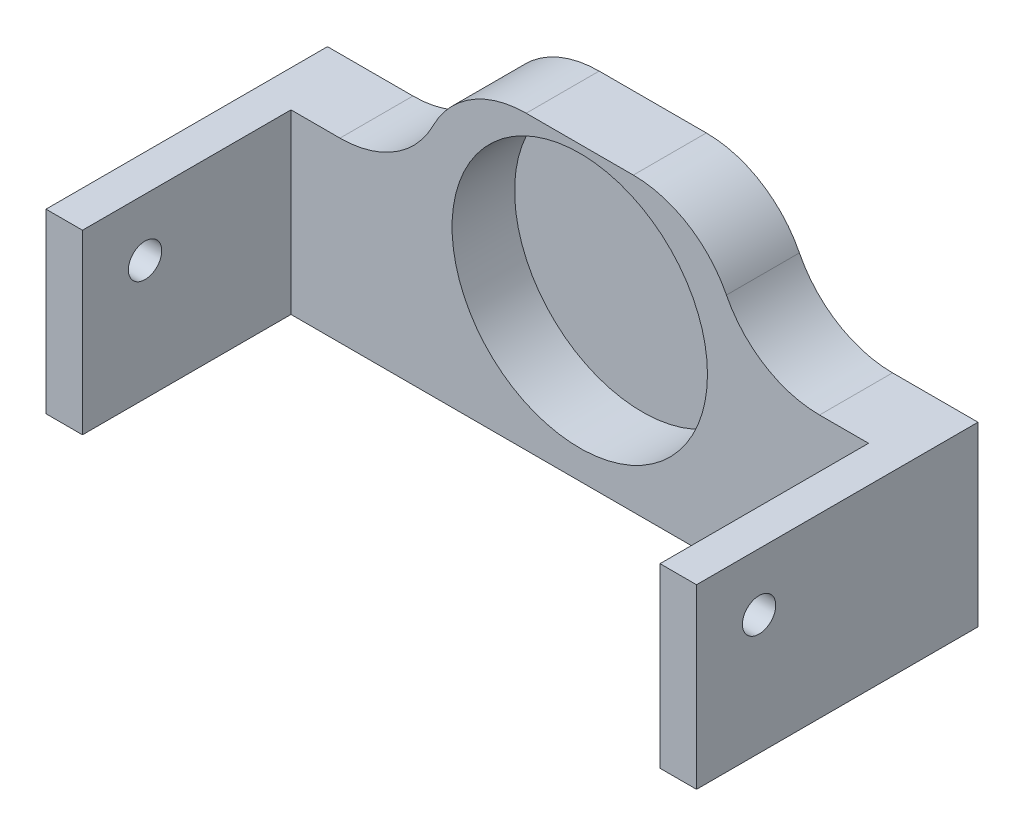
ISO-10303-21;
HEADER;
FILE_DESCRIPTION(('STEP AP214'),'2;1');
FILE_NAME('part.step','',(''),(''),'','','');
FILE_SCHEMA(('AUTOMOTIVE_DESIGN { 1 0 10303 214 1 1 1 1 }'));
ENDSEC;
DATA;
#1=APPLICATION_CONTEXT('core data for automotive mechanical design processes');
#2=APPLICATION_PROTOCOL_DEFINITION('international standard','automotive_design',2000,#1);
#3=PRODUCT_CONTEXT('',#1,'mechanical');
#4=PRODUCT('Part','Part','',(#3));
#5=PRODUCT_RELATED_PRODUCT_CATEGORY('part','',(#4));
#6=PRODUCT_DEFINITION_FORMATION('','',#4);
#7=PRODUCT_DEFINITION_CONTEXT('part definition',#1,'design');
#8=PRODUCT_DEFINITION('design','',#6,#7);
#9=PRODUCT_DEFINITION_SHAPE('','',#8);
#10=(LENGTH_UNIT() NAMED_UNIT(*) SI_UNIT(.MILLI.,.METRE.));
#11=(NAMED_UNIT(*) PLANE_ANGLE_UNIT() SI_UNIT($,.RADIAN.));
#12=(NAMED_UNIT(*) SI_UNIT($,.STERADIAN.) SOLID_ANGLE_UNIT());
#13=UNCERTAINTY_MEASURE_WITH_UNIT(LENGTH_MEASURE(1.E-05),#10,'distance_accuracy_value','');
#14=(GEOMETRIC_REPRESENTATION_CONTEXT(3) GLOBAL_UNCERTAINTY_ASSIGNED_CONTEXT((#13)) GLOBAL_UNIT_ASSIGNED_CONTEXT((#10,
#11,#12)) REPRESENTATION_CONTEXT('',''));
#15=CARTESIAN_POINT('',(0.,0.,0.));
#16=DIRECTION('',(0.,0.,1.));
#17=DIRECTION('',(1.,0.,0.));
#18=AXIS2_PLACEMENT_3D('',#15,#16,#17);
#19=CARTESIAN_POINT('',(0.,0.,7.));
#20=DIRECTION('',(0.,0.,1.));
#21=DIRECTION('',(1.,0.,0.));
#22=AXIS2_PLACEMENT_3D('',#19,#20,#21);
#23=PLANE('',#22);
#24=CARTESIAN_POINT('',(14.9668356823349,-6.75269130805009,7.));
#25=DIRECTION('',(0.,0.,1.));
#26=DIRECTION('',(1.,0.,0.));
#27=AXIS2_PLACEMENT_3D('',#24,#25,#26);
#28=CIRCLE('',#27,12.25);
#29=CARTESIAN_POINT('',(27.2168356823349,-6.75269130805009,7.));
#30=VERTEX_POINT('',#29);
#31=EDGE_CURVE('E182',#30,#30,#28,.T.);
#32=ORIENTED_EDGE('',*,*,#31,.F.);
#33=EDGE_LOOP('',(#32));
#34=FACE_BOUND('',#33,.T.);
#35=DIRECTION('',(1.,0.,0.));
#36=VECTOR('',#35,1.);
#37=CARTESIAN_POINT('',(-16.2331643176651,-21.7526913080501,7.));
#38=LINE('',#37,#36);
#39=CARTESIAN_POINT('',(-12.7331643176651,-21.7526913080501,7.));
#40=VERTEX_POINT('',#39);
#41=CARTESIAN_POINT('',(42.6668356823349,-21.7526913080501,7.));
#42=VERTEX_POINT('',#41);
#43=EDGE_CURVE('E163',#40,#42,#38,.T.);
#44=ORIENTED_EDGE('',*,*,#43,.T.);
#45=DIRECTION('',(0.,-1.,0.));
#46=VECTOR('',#45,1.);
#47=CARTESIAN_POINT('',(42.6668356823349,-4.75269130805009,7.));
#48=LINE('',#47,#46);
#49=CARTESIAN_POINT('',(42.6668356823349,-4.75269130805009,7.));
#50=VERTEX_POINT('',#49);
#51=EDGE_CURVE('E147',#50,#42,#48,.T.);
#52=ORIENTED_EDGE('',*,*,#51,.F.);
#53=DIRECTION('',(1.,0.,0.));
#54=VECTOR('',#53,1.);
#55=CARTESIAN_POINT('',(46.1668356823349,-4.75269130805009,7.));
#56=LINE('',#55,#54);
#57=CARTESIAN_POINT('',(37.9668356823349,-4.75269130805009,7.));
#58=VERTEX_POINT('',#57);
#59=EDGE_CURVE('E287',#58,#50,#56,.T.);
#60=ORIENTED_EDGE('',*,*,#59,.F.);
#61=CARTESIAN_POINT('',(37.9668356823349,5.24730869194991,7.));
#62=DIRECTION('',(0.,0.,1.));
#63=DIRECTION('',(1.,0.,0.));
#64=AXIS2_PLACEMENT_3D('',#61,#62,#63);
#65=CIRCLE('',#64,10.);
#66=CARTESIAN_POINT('',(29.036550132589,0.747308691949914,7.));
#67=VERTEX_POINT('',#66);
#68=EDGE_CURVE('E209',#58,#67,#65,.F.);
#69=ORIENTED_EDGE('',*,*,#68,.T.);
#70=CARTESIAN_POINT('',(20.1062645828431,-3.75269130805009,7.));
#71=DIRECTION('',(0.,0.,1.));
#72=DIRECTION('',(1.,0.,0.));
#73=AXIS2_PLACEMENT_3D('',#70,#71,#72);
#74=CIRCLE('',#73,10.);
#75=CARTESIAN_POINT('',(20.1062645828431,6.24730869194991,7.));
#76=VERTEX_POINT('',#75);
#77=EDGE_CURVE('E230',#67,#76,#74,.T.);
#78=ORIENTED_EDGE('',*,*,#77,.T.);
#79=DIRECTION('',(-1.,0.,0.));
#80=VECTOR('',#79,1.);
#81=CARTESIAN_POINT('',(-16.2331643176651,6.24730869194991,7.));
#82=LINE('',#81,#80);
#83=CARTESIAN_POINT('',(9.82740678182662,6.24730869194991,7.));
#84=VERTEX_POINT('',#83);
#85=EDGE_CURVE('E170',#76,#84,#82,.T.);
#86=ORIENTED_EDGE('',*,*,#85,.T.);
#87=CARTESIAN_POINT('',(9.82740678182662,-3.75269130805009,7.));
#88=DIRECTION('',(0.,0.,1.));
#89=DIRECTION('',(1.,0.,0.));
#90=AXIS2_PLACEMENT_3D('',#87,#88,#89);
#91=CIRCLE('',#90,10.);
#92=CARTESIAN_POINT('',(0.897121232080748,0.747308691949914,7.));
#93=VERTEX_POINT('',#92);
#94=EDGE_CURVE('E227',#84,#93,#91,.T.);
#95=ORIENTED_EDGE('',*,*,#94,.T.);
#96=CARTESIAN_POINT('',(-8.03316431766513,5.24730869194991,7.));
#97=DIRECTION('',(0.,0.,1.));
#98=DIRECTION('',(1.,0.,0.));
#99=AXIS2_PLACEMENT_3D('',#96,#97,#98);
#100=CIRCLE('',#99,10.);
#101=CARTESIAN_POINT('',(-8.03316431766513,-4.75269130805009,7.));
#102=VERTEX_POINT('',#101);
#103=EDGE_CURVE('E216',#93,#102,#100,.F.);
#104=ORIENTED_EDGE('',*,*,#103,.T.);
#105=DIRECTION('',(1.,0.,0.));
#106=VECTOR('',#105,1.);
#107=CARTESIAN_POINT('',(-16.2331643176651,-4.75269130805009,7.));
#108=LINE('',#107,#106);
#109=CARTESIAN_POINT('',(-12.7331643176651,-4.75269130805009,7.));
#110=VERTEX_POINT('',#109);
#111=EDGE_CURVE('E272',#110,#102,#108,.T.);
#112=ORIENTED_EDGE('',*,*,#111,.F.);
#113=DIRECTION('',(0.,1.,0.));
#114=VECTOR('',#113,1.);
#115=CARTESIAN_POINT('',(-12.7331643176651,-4.75269130805009,7.));
#116=LINE('',#115,#114);
#117=EDGE_CURVE('E60',#40,#110,#116,.T.);
#118=ORIENTED_EDGE('',*,*,#117,.F.);
#119=EDGE_LOOP('',(#44,#52,#60,#69,#78,#86,#95,#104,#112,#118));
#120=FACE_BOUND('',#119,.T.);
#121=ADVANCED_FACE('F43',(#34,#120),#23,.T.);
#122=CARTESIAN_POINT('',(-16.2331643176651,6.24730869194991,7.));
#123=DIRECTION('',(1.,0.,0.));
#124=DIRECTION('',(0.,1.,0.));
#125=AXIS2_PLACEMENT_3D('',#122,#123,#124);
#126=PLANE('',#125);
#127=CARTESIAN_POINT('',(-16.2331643176651,-10.2526913080501,21.));
#128=DIRECTION('',(-1.,0.,0.));
#129=DIRECTION('',(0.,-1.,0.));
#130=AXIS2_PLACEMENT_3D('',#127,#128,#129);
#131=CIRCLE('',#130,1.6);
#132=CARTESIAN_POINT('',(-16.2331643176651,-11.8526913080501,21.));
#133=VERTEX_POINT('',#132);
#134=EDGE_CURVE('E515',#133,#133,#131,.T.);
#135=ORIENTED_EDGE('',*,*,#134,.F.);
#136=EDGE_LOOP('',(#135));
#137=FACE_BOUND('',#136,.T.);
#138=DIRECTION('',(0.,0.,-1.));
#139=VECTOR('',#138,1.);
#140=CARTESIAN_POINT('',(-16.2331643176651,-21.7526913080501,7.));
#141=LINE('',#140,#139);
#142=CARTESIAN_POINT('',(-16.2331643176651,-21.7526913080501,27.));
#143=VERTEX_POINT('',#142);
#144=CARTESIAN_POINT('',(-16.2331643176651,-21.7526913080501,0.));
#145=VERTEX_POINT('',#144);
#146=EDGE_CURVE('E198',#143,#145,#141,.T.);
#147=ORIENTED_EDGE('',*,*,#146,.F.);
#148=DIRECTION('',(0.,-1.,0.));
#149=VECTOR('',#148,1.);
#150=CARTESIAN_POINT('',(-16.2331643176651,-4.75269130805009,27.));
#151=LINE('',#150,#149);
#152=CARTESIAN_POINT('',(-16.2331643176651,-4.75269130805009,27.));
#153=VERTEX_POINT('',#152);
#154=EDGE_CURVE('E539',#153,#143,#151,.T.);
#155=ORIENTED_EDGE('',*,*,#154,.F.);
#156=DIRECTION('',(0.,0.,1.));
#157=VECTOR('',#156,1.);
#158=CARTESIAN_POINT('',(-16.2331643176651,-4.75269130805009,-0.00100000000000013));
#159=LINE('',#158,#157);
#160=CARTESIAN_POINT('',(-16.2331643176651,-4.75269130805009,0.));
#161=VERTEX_POINT('',#160);
#162=EDGE_CURVE('E276',#161,#153,#159,.T.);
#163=ORIENTED_EDGE('',*,*,#162,.F.);
#164=DIRECTION('',(0.,-1.,0.));
#165=VECTOR('',#164,1.);
#166=CARTESIAN_POINT('',(-16.2331643176651,6.24730869194991,0.));
#167=LINE('',#166,#165);
#168=EDGE_CURVE('E185',#161,#145,#167,.T.);
#169=ORIENTED_EDGE('',*,*,#168,.T.);
#170=EDGE_LOOP('',(#147,#155,#163,#169));
#171=FACE_BOUND('',#170,.T.);
#172=ADVANCED_FACE('F306',(#137,#171),#126,.F.);
#173=CARTESIAN_POINT('',(-16.2331643176651,-21.7526913080501,7.));
#174=DIRECTION('',(0.,1.,0.));
#175=DIRECTION('',(0.,0.,1.));
#176=AXIS2_PLACEMENT_3D('',#173,#174,#175);
#177=PLANE('',#176);
#178=DIRECTION('',(1.,0.,0.));
#179=VECTOR('',#178,1.);
#180=CARTESIAN_POINT('',(-16.2331643176651,-21.7526913080501,0.));
#181=LINE('',#180,#179);
#182=CARTESIAN_POINT('',(46.1668356823349,-21.7526913080501,0.));
#183=VERTEX_POINT('',#182);
#184=EDGE_CURVE('E188',#145,#183,#181,.T.);
#185=ORIENTED_EDGE('',*,*,#184,.T.);
#186=DIRECTION('',(0.,0.,-1.));
#187=VECTOR('',#186,1.);
#188=CARTESIAN_POINT('',(46.1668356823349,-21.7526913080501,7.));
#189=LINE('',#188,#187);
#190=CARTESIAN_POINT('',(46.1668356823349,-21.7526913080501,27.));
#191=VERTEX_POINT('',#190);
#192=EDGE_CURVE('E176',#191,#183,#189,.T.);
#193=ORIENTED_EDGE('',*,*,#192,.F.);
#194=DIRECTION('',(1.,0.,0.));
#195=VECTOR('',#194,1.);
#196=CARTESIAN_POINT('',(46.1668356823349,-21.7526913080501,27.));
#197=LINE('',#196,#195);
#198=CARTESIAN_POINT('',(42.6668356823349,-21.7526913080501,27.));
#199=VERTEX_POINT('',#198);
#200=EDGE_CURVE('E166',#199,#191,#197,.T.);
#201=ORIENTED_EDGE('',*,*,#200,.F.);
#202=DIRECTION('',(0.,0.,-1.));
#203=VECTOR('',#202,1.);
#204=CARTESIAN_POINT('',(42.6668356823349,-21.7526913080501,27.));
#205=LINE('',#204,#203);
#206=EDGE_CURVE('E151',#199,#42,#205,.T.);
#207=ORIENTED_EDGE('',*,*,#206,.T.);
#208=ORIENTED_EDGE('',*,*,#43,.F.);
#209=DIRECTION('',(0.,0.,-1.));
#210=VECTOR('',#209,1.);
#211=CARTESIAN_POINT('',(-12.7331643176651,-21.7526913080501,27.));
#212=LINE('',#211,#210);
#213=CARTESIAN_POINT('',(-12.7331643176651,-21.7526913080501,27.));
#214=VERTEX_POINT('',#213);
#215=EDGE_CURVE('E288',#214,#40,#212,.T.);
#216=ORIENTED_EDGE('',*,*,#215,.F.);
#217=DIRECTION('',(1.,0.,0.));
#218=VECTOR('',#217,1.);
#219=CARTESIAN_POINT('',(-16.2331643176651,-21.7526913080501,27.));
#220=LINE('',#219,#218);
#221=EDGE_CURVE('E543',#143,#214,#220,.T.);
#222=ORIENTED_EDGE('',*,*,#221,.F.);
#223=ORIENTED_EDGE('',*,*,#146,.T.);
#224=EDGE_LOOP('',(#185,#193,#201,#207,#208,#216,#222,#223));
#225=FACE_BOUND('',#224,.T.);
#226=ADVANCED_FACE('F161',(#225),#177,.F.);
#227=CARTESIAN_POINT('',(46.1668356823349,6.24730869194991,7.));
#228=DIRECTION('',(-1.,0.,0.));
#229=DIRECTION('',(0.,0.,1.));
#230=AXIS2_PLACEMENT_3D('',#227,#228,#229);
#231=PLANE('',#230);
#232=CARTESIAN_POINT('',(46.1668356823349,-10.2526913080501,21.));
#233=DIRECTION('',(-1.,0.,0.));
#234=DIRECTION('',(0.,-1.,0.));
#235=AXIS2_PLACEMENT_3D('',#232,#233,#234);
#236=CIRCLE('',#235,1.6);
#237=CARTESIAN_POINT('',(46.1668356823349,-11.8526913080501,21.));
#238=VERTEX_POINT('',#237);
#239=EDGE_CURVE('E524',#238,#238,#236,.T.);
#240=ORIENTED_EDGE('',*,*,#239,.T.);
#241=EDGE_LOOP('',(#240));
#242=FACE_BOUND('',#241,.T.);
#243=DIRECTION('',(0.,1.,0.));
#244=VECTOR('',#243,1.);
#245=CARTESIAN_POINT('',(46.1668356823349,6.24730869194991,0.));
#246=LINE('',#245,#244);
#247=CARTESIAN_POINT('',(46.1668356823349,-4.75269130805009,0.));
#248=VERTEX_POINT('',#247);
#249=EDGE_CURVE('E179',#183,#248,#246,.T.);
#250=ORIENTED_EDGE('',*,*,#249,.T.);
#251=DIRECTION('',(0.,0.,1.));
#252=VECTOR('',#251,1.);
#253=CARTESIAN_POINT('',(46.1668356823349,-4.75269130805009,-0.00100000000000013));
#254=LINE('',#253,#252);
#255=CARTESIAN_POINT('',(46.1668356823349,-4.75269130805009,27.));
#256=VERTEX_POINT('',#255);
#257=EDGE_CURVE('E284',#248,#256,#254,.T.);
#258=ORIENTED_EDGE('',*,*,#257,.T.);
#259=DIRECTION('',(0.,1.,0.));
#260=VECTOR('',#259,1.);
#261=CARTESIAN_POINT('',(46.1668356823349,-4.75269130805009,27.));
#262=LINE('',#261,#260);
#263=EDGE_CURVE('E158',#191,#256,#262,.T.);
#264=ORIENTED_EDGE('',*,*,#263,.F.);
#265=ORIENTED_EDGE('',*,*,#192,.T.);
#266=EDGE_LOOP('',(#250,#258,#264,#265));
#267=FACE_BOUND('',#266,.T.);
#268=ADVANCED_FACE('F319',(#242,#267),#231,.F.);
#269=CARTESIAN_POINT('',(-16.2331643176651,6.24730869194991,7.));
#270=DIRECTION('',(0.,-1.,0.));
#271=DIRECTION('',(0.,0.,-1.));
#272=AXIS2_PLACEMENT_3D('',#269,#270,#271);
#273=PLANE('',#272);
#274=ORIENTED_EDGE('',*,*,#85,.F.);
#275=DIRECTION('',(0.,0.,-1.));
#276=VECTOR('',#275,1.);
#277=CARTESIAN_POINT('',(20.1062645828431,6.24730869194991,7.));
#278=LINE('',#277,#276);
#279=CARTESIAN_POINT('',(20.1062645828431,6.24730869194991,0.));
#280=VERTEX_POINT('',#279);
#281=EDGE_CURVE('E237',#76,#280,#278,.T.);
#282=ORIENTED_EDGE('',*,*,#281,.T.);
#283=DIRECTION('',(-1.,0.,0.));
#284=VECTOR('',#283,1.);
#285=CARTESIAN_POINT('',(-16.2331643176651,6.24730869194991,0.));
#286=LINE('',#285,#284);
#287=CARTESIAN_POINT('',(9.82740678182662,6.24730869194991,0.));
#288=VERTEX_POINT('',#287);
#289=EDGE_CURVE('E171',#280,#288,#286,.T.);
#290=ORIENTED_EDGE('',*,*,#289,.T.);
#291=DIRECTION('',(0.,0.,-1.));
#292=VECTOR('',#291,1.);
#293=CARTESIAN_POINT('',(9.82740678182662,6.24730869194991,7.));
#294=LINE('',#293,#292);
#295=EDGE_CURVE('E233',#288,#84,#294,.F.);
#296=ORIENTED_EDGE('',*,*,#295,.T.);
#297=EDGE_LOOP('',(#274,#282,#290,#296));
#298=FACE_BOUND('',#297,.T.);
#299=ADVANCED_FACE('F260',(#298),#273,.F.);
#300=CARTESIAN_POINT('',(0.,0.,0.));
#301=DIRECTION('',(0.,0.,1.));
#302=DIRECTION('',(1.,0.,0.));
#303=AXIS2_PLACEMENT_3D('',#300,#301,#302);
#304=PLANE('',#303);
#305=ORIENTED_EDGE('',*,*,#289,.F.);
#306=CARTESIAN_POINT('',(20.1062645828431,-3.75269130805009,0.));
#307=DIRECTION('',(0.,0.,1.));
#308=DIRECTION('',(1.,0.,0.));
#309=AXIS2_PLACEMENT_3D('',#306,#307,#308);
#310=CIRCLE('',#309,10.);
#311=CARTESIAN_POINT('',(29.036550132589,0.747308691949914,0.));
#312=VERTEX_POINT('',#311);
#313=EDGE_CURVE('E53',#280,#312,#310,.F.);
#314=ORIENTED_EDGE('',*,*,#313,.T.);
#315=CARTESIAN_POINT('',(37.9668356823349,5.24730869194991,0.));
#316=DIRECTION('',(0.,0.,1.));
#317=DIRECTION('',(1.,0.,0.));
#318=AXIS2_PLACEMENT_3D('',#315,#316,#317);
#319=CIRCLE('',#318,10.);
#320=CARTESIAN_POINT('',(37.9668356823349,-4.75269130805009,0.));
#321=VERTEX_POINT('',#320);
#322=EDGE_CURVE('E213',#312,#321,#319,.T.);
#323=ORIENTED_EDGE('',*,*,#322,.T.);
#324=DIRECTION('',(-1.,0.,0.));
#325=VECTOR('',#324,1.);
#326=CARTESIAN_POINT('',(46.1668356823349,-4.75269130805009,0.));
#327=LINE('',#326,#325);
#328=EDGE_CURVE('E291',#248,#321,#327,.T.);
#329=ORIENTED_EDGE('',*,*,#328,.F.);
#330=ORIENTED_EDGE('',*,*,#249,.F.);
#331=ORIENTED_EDGE('',*,*,#184,.F.);
#332=ORIENTED_EDGE('',*,*,#168,.F.);
#333=DIRECTION('',(-1.,0.,0.));
#334=VECTOR('',#333,1.);
#335=CARTESIAN_POINT('',(-16.2331643176651,-4.75269130805009,0.));
#336=LINE('',#335,#334);
#337=CARTESIAN_POINT('',(-8.03316431766513,-4.75269130805009,0.));
#338=VERTEX_POINT('',#337);
#339=EDGE_CURVE('E269',#338,#161,#336,.T.);
#340=ORIENTED_EDGE('',*,*,#339,.F.);
#341=CARTESIAN_POINT('',(-8.03316431766513,5.24730869194991,0.));
#342=DIRECTION('',(0.,0.,1.));
#343=DIRECTION('',(1.,0.,0.));
#344=AXIS2_PLACEMENT_3D('',#341,#342,#343);
#345=CIRCLE('',#344,10.);
#346=CARTESIAN_POINT('',(0.897121232080748,0.747308691949914,0.));
#347=VERTEX_POINT('',#346);
#348=EDGE_CURVE('E220',#338,#347,#345,.T.);
#349=ORIENTED_EDGE('',*,*,#348,.T.);
#350=CARTESIAN_POINT('',(9.82740678182662,-3.75269130805009,0.));
#351=DIRECTION('',(0.,0.,1.));
#352=DIRECTION('',(1.,0.,0.));
#353=AXIS2_PLACEMENT_3D('',#350,#351,#352);
#354=CIRCLE('',#353,10.);
#355=EDGE_CURVE('E240',#347,#288,#354,.F.);
#356=ORIENTED_EDGE('',*,*,#355,.T.);
#357=EDGE_LOOP('',(#305,#314,#323,#329,#330,#331,#332,#340,#349,#356));
#358=FACE_BOUND('',#357,.T.);
#359=ADVANCED_FACE('F248',(#358),#304,.F.);
#360=CARTESIAN_POINT('',(14.9668356823349,-6.75269130805009,1.));
#361=DIRECTION('',(0.,0.,1.));
#362=DIRECTION('',(1.,0.,0.));
#363=AXIS2_PLACEMENT_3D('',#360,#361,#362);
#364=CYLINDRICAL_SURFACE('',#363,12.25);
#365=CARTESIAN_POINT('',(14.9668356823349,-6.75269130805009,1.));
#366=DIRECTION('',(0.,0.,1.));
#367=DIRECTION('',(1.,0.,0.));
#368=AXIS2_PLACEMENT_3D('',#365,#366,#367);
#369=CIRCLE('',#368,12.25);
#370=CARTESIAN_POINT('',(27.2168356823349,-6.75269130805009,1.));
#371=VERTEX_POINT('',#370);
#372=EDGE_CURVE('E189',#371,#371,#369,.T.);
#373=ORIENTED_EDGE('',*,*,#372,.F.);
#374=EDGE_LOOP('',(#373));
#375=FACE_BOUND('',#374,.T.);
#376=ORIENTED_EDGE('',*,*,#31,.T.);
#377=EDGE_LOOP('',(#376));
#378=FACE_BOUND('',#377,.T.);
#379=ADVANCED_FACE('F299',(#375,#378),#364,.F.);
#380=CARTESIAN_POINT('',(14.9668356823349,-6.75269130805009,1.));
#381=DIRECTION('',(0.,0.,1.));
#382=DIRECTION('',(1.,0.,0.));
#383=AXIS2_PLACEMENT_3D('',#380,#381,#382);
#384=PLANE('',#383);
#385=ORIENTED_EDGE('',*,*,#372,.T.);
#386=EDGE_LOOP('',(#385));
#387=FACE_BOUND('',#386,.T.);
#388=ADVANCED_FACE('F297',(#387),#384,.T.);
#389=CARTESIAN_POINT('',(46.1668356823349,-4.75269130805009,-0.00100000000000013));
#390=DIRECTION('',(0.,-1.,0.));
#391=DIRECTION('',(0.,0.,-1.));
#392=AXIS2_PLACEMENT_3D('',#389,#390,#391);
#393=PLANE('',#392);
#394=ORIENTED_EDGE('',*,*,#328,.T.);
#395=DIRECTION('',(0.,0.,1.));
#396=VECTOR('',#395,1.);
#397=CARTESIAN_POINT('',(37.9668356823349,-4.75269130805009,7.));
#398=LINE('',#397,#396);
#399=EDGE_CURVE('E202',#321,#58,#398,.T.);
#400=ORIENTED_EDGE('',*,*,#399,.T.);
#401=ORIENTED_EDGE('',*,*,#59,.T.);
#402=DIRECTION('',(0.,0.,-1.));
#403=VECTOR('',#402,1.);
#404=CARTESIAN_POINT('',(42.6668356823349,-4.75269130805009,27.));
#405=LINE('',#404,#403);
#406=CARTESIAN_POINT('',(42.6668356823349,-4.75269130805009,27.));
#407=VERTEX_POINT('',#406);
#408=EDGE_CURVE('E154',#407,#50,#405,.T.);
#409=ORIENTED_EDGE('',*,*,#408,.F.);
#410=DIRECTION('',(-1.,0.,0.));
#411=VECTOR('',#410,1.);
#412=CARTESIAN_POINT('',(46.1668356823349,-4.75269130805009,27.));
#413=LINE('',#412,#411);
#414=EDGE_CURVE('E533',#256,#407,#413,.T.);
#415=ORIENTED_EDGE('',*,*,#414,.F.);
#416=ORIENTED_EDGE('',*,*,#257,.F.);
#417=EDGE_LOOP('',(#394,#400,#401,#409,#415,#416));
#418=FACE_BOUND('',#417,.T.);
#419=ADVANCED_FACE('F350',(#418),#393,.F.);
#420=CARTESIAN_POINT('',(-16.2331643176651,-4.75269130805009,-0.00100000000000013));
#421=DIRECTION('',(0.,-1.,0.));
#422=DIRECTION('',(0.,0.,-1.));
#423=AXIS2_PLACEMENT_3D('',#420,#421,#422);
#424=PLANE('',#423);
#425=ORIENTED_EDGE('',*,*,#162,.T.);
#426=DIRECTION('',(-1.,0.,0.));
#427=VECTOR('',#426,1.);
#428=CARTESIAN_POINT('',(-16.2331643176651,-4.75269130805009,27.));
#429=LINE('',#428,#427);
#430=CARTESIAN_POINT('',(-12.7331643176651,-4.75269130805009,27.));
#431=VERTEX_POINT('',#430);
#432=EDGE_CURVE('E549',#431,#153,#429,.T.);
#433=ORIENTED_EDGE('',*,*,#432,.F.);
#434=DIRECTION('',(0.,0.,-1.));
#435=VECTOR('',#434,1.);
#436=CARTESIAN_POINT('',(-12.7331643176651,-4.75269130805009,27.));
#437=LINE('',#436,#435);
#438=EDGE_CURVE('E553',#431,#110,#437,.T.);
#439=ORIENTED_EDGE('',*,*,#438,.T.);
#440=ORIENTED_EDGE('',*,*,#111,.T.);
#441=DIRECTION('',(0.,0.,1.));
#442=VECTOR('',#441,1.);
#443=CARTESIAN_POINT('',(-8.03316431766513,-4.75269130805009,0.));
#444=LINE('',#443,#442);
#445=EDGE_CURVE('E206',#102,#338,#444,.F.);
#446=ORIENTED_EDGE('',*,*,#445,.T.);
#447=ORIENTED_EDGE('',*,*,#339,.T.);
#448=EDGE_LOOP('',(#425,#433,#439,#440,#446,#447));
#449=FACE_BOUND('',#448,.T.);
#450=ADVANCED_FACE('F268',(#449),#424,.F.);
#451=CARTESIAN_POINT('',(37.9668356823349,5.24730869194991,-0.00100000000000013));
#452=DIRECTION('',(0.,0.,-1.));
#453=DIRECTION('',(-1.,0.,0.));
#454=AXIS2_PLACEMENT_3D('',#451,#452,#453);
#455=CYLINDRICAL_SURFACE('',#454,10.);
#456=ORIENTED_EDGE('',*,*,#322,.F.);
#457=DIRECTION('',(0.,0.,-1.));
#458=VECTOR('',#457,1.);
#459=CARTESIAN_POINT('',(29.036550132589,0.747308691949915,-0.00100000000000013));
#460=LINE('',#459,#458);
#461=EDGE_CURVE('E223',#312,#67,#460,.F.);
#462=ORIENTED_EDGE('',*,*,#461,.T.);
#463=ORIENTED_EDGE('',*,*,#68,.F.);
#464=ORIENTED_EDGE('',*,*,#399,.F.);
#465=EDGE_LOOP('',(#456,#462,#463,#464));
#466=FACE_BOUND('',#465,.T.);
#467=ADVANCED_FACE('F256',(#466),#455,.F.);
#468=CARTESIAN_POINT('',(-8.03316431766513,5.24730869194991,-0.00100000000000013));
#469=DIRECTION('',(0.,0.,-1.));
#470=DIRECTION('',(-1.,0.,0.));
#471=AXIS2_PLACEMENT_3D('',#468,#469,#470);
#472=CYLINDRICAL_SURFACE('',#471,10.);
#473=ORIENTED_EDGE('',*,*,#103,.F.);
#474=DIRECTION('',(0.,0.,-1.));
#475=VECTOR('',#474,1.);
#476=CARTESIAN_POINT('',(0.897121232080748,0.747308691949914,-0.00100000000000013));
#477=LINE('',#476,#475);
#478=EDGE_CURVE('E11',#93,#347,#477,.T.);
#479=ORIENTED_EDGE('',*,*,#478,.T.);
#480=ORIENTED_EDGE('',*,*,#348,.F.);
#481=ORIENTED_EDGE('',*,*,#445,.F.);
#482=EDGE_LOOP('',(#473,#479,#480,#481));
#483=FACE_BOUND('',#482,.T.);
#484=ADVANCED_FACE('F265',(#483),#472,.F.);
#485=CARTESIAN_POINT('',(20.1062645828431,-3.75269130805009,-0.00100000000000013));
#486=DIRECTION('',(0.,0.,-1.));
#487=DIRECTION('',(-1.,0.,0.));
#488=AXIS2_PLACEMENT_3D('',#485,#486,#487);
#489=CYLINDRICAL_SURFACE('',#488,10.);
#490=ORIENTED_EDGE('',*,*,#313,.F.);
#491=ORIENTED_EDGE('',*,*,#281,.F.);
#492=ORIENTED_EDGE('',*,*,#77,.F.);
#493=ORIENTED_EDGE('',*,*,#461,.F.);
#494=EDGE_LOOP('',(#490,#491,#492,#493));
#495=FACE_BOUND('',#494,.T.);
#496=ADVANCED_FACE('F257',(#495),#489,.T.);
#497=CARTESIAN_POINT('',(9.82740678182662,-3.75269130805009,-0.00100000000000013));
#498=DIRECTION('',(0.,0.,-1.));
#499=DIRECTION('',(-1.,0.,0.));
#500=AXIS2_PLACEMENT_3D('',#497,#498,#499);
#501=CYLINDRICAL_SURFACE('',#500,10.);
#502=ORIENTED_EDGE('',*,*,#355,.F.);
#503=ORIENTED_EDGE('',*,*,#478,.F.);
#504=ORIENTED_EDGE('',*,*,#94,.F.);
#505=ORIENTED_EDGE('',*,*,#295,.F.);
#506=EDGE_LOOP('',(#502,#503,#504,#505));
#507=FACE_BOUND('',#506,.T.);
#508=ADVANCED_FACE('F45',(#507),#501,.T.);
#509=CARTESIAN_POINT('',(-12.7331643176651,-4.75269130805009,27.));
#510=DIRECTION('',(-1.,0.,0.));
#511=DIRECTION('',(0.,-1.,0.));
#512=AXIS2_PLACEMENT_3D('',#509,#510,#511);
#513=PLANE('',#512);
#514=CARTESIAN_POINT('',(-12.7331643176651,-10.2526913080501,21.));
#515=DIRECTION('',(-1.,0.,0.));
#516=DIRECTION('',(0.,-1.,0.));
#517=AXIS2_PLACEMENT_3D('',#514,#515,#516);
#518=CIRCLE('',#517,1.6);
#519=CARTESIAN_POINT('',(-12.7331643176651,-11.8526913080501,21.));
#520=VERTEX_POINT('',#519);
#521=EDGE_CURVE('E517',#520,#520,#518,.T.);
#522=ORIENTED_EDGE('',*,*,#521,.T.);
#523=EDGE_LOOP('',(#522));
#524=FACE_BOUND('',#523,.T.);
#525=ORIENTED_EDGE('',*,*,#117,.T.);
#526=ORIENTED_EDGE('',*,*,#438,.F.);
#527=DIRECTION('',(0.,1.,0.));
#528=VECTOR('',#527,1.);
#529=CARTESIAN_POINT('',(-12.7331643176651,-4.75269130805009,27.));
#530=LINE('',#529,#528);
#531=EDGE_CURVE('E546',#214,#431,#530,.T.);
#532=ORIENTED_EDGE('',*,*,#531,.F.);
#533=ORIENTED_EDGE('',*,*,#215,.T.);
#534=EDGE_LOOP('',(#525,#526,#532,#533));
#535=FACE_BOUND('',#534,.T.);
#536=ADVANCED_FACE('F332',(#524,#535),#513,.F.);
#537=CARTESIAN_POINT('',(0.,0.,27.));
#538=DIRECTION('',(0.,0.,1.));
#539=DIRECTION('',(1.,0.,0.));
#540=AXIS2_PLACEMENT_3D('',#537,#538,#539);
#541=PLANE('',#540);
#542=ORIENTED_EDGE('',*,*,#154,.T.);
#543=ORIENTED_EDGE('',*,*,#221,.T.);
#544=ORIENTED_EDGE('',*,*,#531,.T.);
#545=ORIENTED_EDGE('',*,*,#432,.T.);
#546=EDGE_LOOP('',(#542,#543,#544,#545));
#547=FACE_BOUND('',#546,.T.);
#548=ADVANCED_FACE('F336',(#547),#541,.T.);
#549=CARTESIAN_POINT('',(42.6668356823349,-4.75269130805009,27.));
#550=DIRECTION('',(1.,0.,0.));
#551=DIRECTION('',(0.,0.,-1.));
#552=AXIS2_PLACEMENT_3D('',#549,#550,#551);
#553=PLANE('',#552);
#554=CARTESIAN_POINT('',(42.6668356823349,-10.2526913080501,21.));
#555=DIRECTION('',(1.,0.,0.));
#556=DIRECTION('',(0.,0.,-1.));
#557=AXIS2_PLACEMENT_3D('',#554,#555,#556);
#558=CIRCLE('',#557,1.6);
#559=CARTESIAN_POINT('',(42.6668356823349,-10.2526913080501,19.4));
#560=VERTEX_POINT('',#559);
#561=EDGE_CURVE('E47',#560,#560,#558,.T.);
#562=ORIENTED_EDGE('',*,*,#561,.T.);
#563=EDGE_LOOP('',(#562));
#564=FACE_BOUND('',#563,.T.);
#565=ORIENTED_EDGE('',*,*,#51,.T.);
#566=ORIENTED_EDGE('',*,*,#206,.F.);
#567=DIRECTION('',(0.,-1.,0.));
#568=VECTOR('',#567,1.);
#569=CARTESIAN_POINT('',(42.6668356823349,-4.75269130805009,27.));
#570=LINE('',#569,#568);
#571=EDGE_CURVE('E530',#407,#199,#570,.T.);
#572=ORIENTED_EDGE('',*,*,#571,.F.);
#573=ORIENTED_EDGE('',*,*,#408,.T.);
#574=EDGE_LOOP('',(#565,#566,#572,#573));
#575=FACE_BOUND('',#574,.T.);
#576=ADVANCED_FACE('F149',(#564,#575),#553,.F.);
#577=CARTESIAN_POINT('',(0.,0.,27.));
#578=DIRECTION('',(0.,0.,-1.));
#579=DIRECTION('',(-1.,0.,0.));
#580=AXIS2_PLACEMENT_3D('',#577,#578,#579);
#581=PLANE('',#580);
#582=ORIENTED_EDGE('',*,*,#263,.T.);
#583=ORIENTED_EDGE('',*,*,#414,.T.);
#584=ORIENTED_EDGE('',*,*,#571,.T.);
#585=ORIENTED_EDGE('',*,*,#200,.T.);
#586=EDGE_LOOP('',(#582,#583,#584,#585));
#587=FACE_BOUND('',#586,.T.);
#588=ADVANCED_FACE('F474',(#587),#581,.F.);
#589=CARTESIAN_POINT('',(46.1668356823349,-10.2526913080501,21.));
#590=DIRECTION('',(-1.,0.,0.));
#591=DIRECTION('',(0.,-1.,0.));
#592=AXIS2_PLACEMENT_3D('',#589,#590,#591);
#593=CYLINDRICAL_SURFACE('',#592,1.6);
#594=ORIENTED_EDGE('',*,*,#239,.F.);
#595=EDGE_LOOP('',(#594));
#596=FACE_BOUND('',#595,.T.);
#597=ORIENTED_EDGE('',*,*,#561,.F.);
#598=EDGE_LOOP('',(#597));
#599=FACE_BOUND('',#598,.T.);
#600=ADVANCED_FACE('F485',(#596,#599),#593,.F.);
#601=ORIENTED_EDGE('',*,*,#134,.T.);
#602=EDGE_LOOP('',(#601));
#603=FACE_BOUND('',#602,.T.);
#604=ORIENTED_EDGE('',*,*,#521,.F.);
#605=EDGE_LOOP('',(#604));
#606=FACE_BOUND('',#605,.T.);
#607=ADVANCED_FACE('F494',(#603,#606),#593,.F.);
#608=CLOSED_SHELL('',(#121,#172,#226,#268,#299,#359,#379,#388,#419,#450,#467,#484,#496,#508,
#536,#548,#576,#588,#600,#607));
#609=MANIFOLD_SOLID_BREP('B2',#608);
#610=ADVANCED_BREP_SHAPE_REPRESENTATION('',(#18,#609),#14);
#611=SHAPE_DEFINITION_REPRESENTATION(#9,#610);
ENDSEC;
END-ISO-10303-21;
